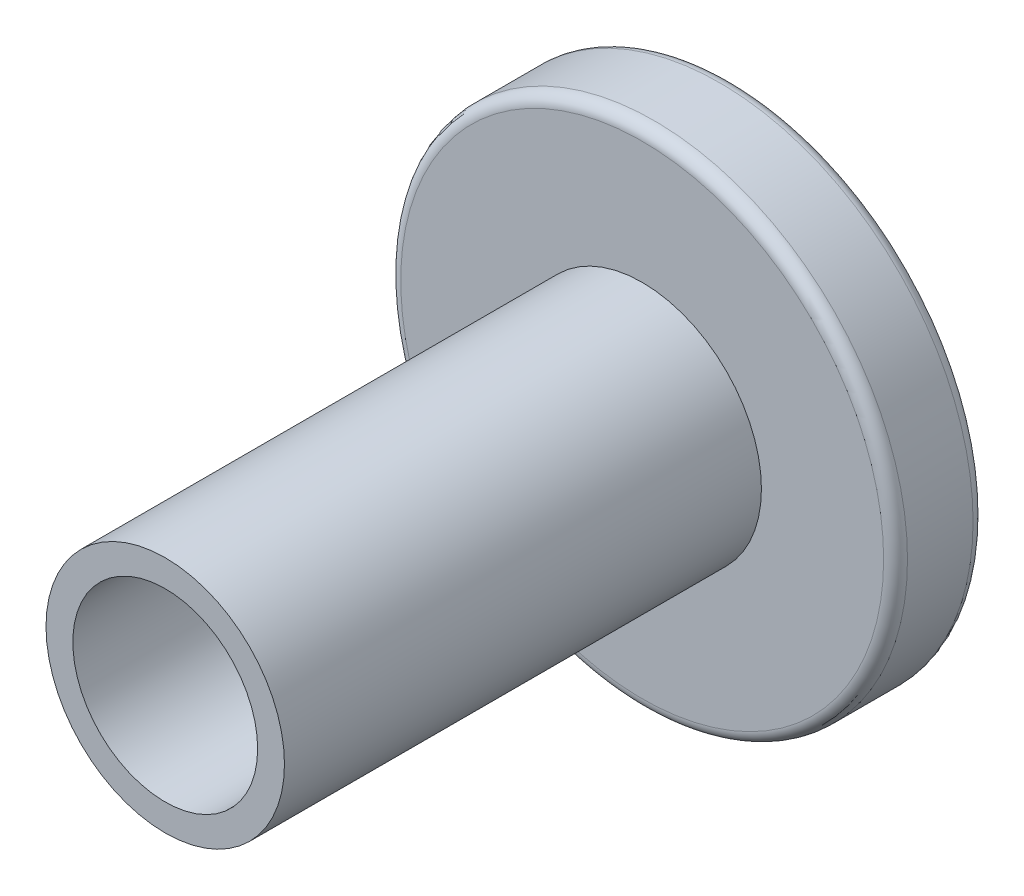
ISO-10303-21;
HEADER;
FILE_DESCRIPTION(('STEP AP214'),'2;1');
FILE_NAME('part.step','',(''),(''),'','','');
FILE_SCHEMA(('AUTOMOTIVE_DESIGN { 1 0 10303 214 1 1 1 1 }'));
ENDSEC;
DATA;
#1=APPLICATION_CONTEXT('core data for automotive mechanical design processes');
#2=APPLICATION_PROTOCOL_DEFINITION('international standard','automotive_design',2000,#1);
#3=PRODUCT_CONTEXT('',#1,'mechanical');
#4=PRODUCT('Part','Part','',(#3));
#5=PRODUCT_RELATED_PRODUCT_CATEGORY('part','',(#4));
#6=PRODUCT_DEFINITION_FORMATION('','',#4);
#7=PRODUCT_DEFINITION_CONTEXT('part definition',#1,'design');
#8=PRODUCT_DEFINITION('design','',#6,#7);
#9=PRODUCT_DEFINITION_SHAPE('','',#8);
#10=(LENGTH_UNIT() NAMED_UNIT(*) SI_UNIT(.MILLI.,.METRE.));
#11=(NAMED_UNIT(*) PLANE_ANGLE_UNIT() SI_UNIT($,.RADIAN.));
#12=(NAMED_UNIT(*) SI_UNIT($,.STERADIAN.) SOLID_ANGLE_UNIT());
#13=UNCERTAINTY_MEASURE_WITH_UNIT(LENGTH_MEASURE(1.E-05),#10,'distance_accuracy_value','');
#14=(GEOMETRIC_REPRESENTATION_CONTEXT(3) GLOBAL_UNCERTAINTY_ASSIGNED_CONTEXT((#13)) GLOBAL_UNIT_ASSIGNED_CONTEXT((#10,
#11,#12)) REPRESENTATION_CONTEXT('',''));
#15=CARTESIAN_POINT('',(0.,0.,0.));
#16=DIRECTION('',(0.,0.,1.));
#17=DIRECTION('',(1.,0.,0.));
#18=AXIS2_PLACEMENT_3D('',#15,#16,#17);
#19=CARTESIAN_POINT('',(0.,0.,1.5));
#20=DIRECTION('',(0.,0.,1.));
#21=DIRECTION('',(1.,0.,0.));
#22=AXIS2_PLACEMENT_3D('',#19,#20,#21);
#23=PLANE('',#22);
#24=CARTESIAN_POINT('',(0.,0.,1.5));
#25=DIRECTION('',(0.,0.,1.));
#26=DIRECTION('',(1.,0.,0.));
#27=AXIS2_PLACEMENT_3D('',#24,#25,#26);
#28=CIRCLE('',#27,1.55);
#29=CARTESIAN_POINT('',(1.55,0.,1.5));
#30=VERTEX_POINT('',#29);
#31=EDGE_CURVE('E153',#30,#30,#28,.F.);
#32=ORIENTED_EDGE('',*,*,#31,.F.);
#33=EDGE_LOOP('',(#32));
#34=FACE_BOUND('',#33,.T.);
#35=DIRECTION('',(-1.,0.,0.));
#36=VECTOR('',#35,1.);
#37=CARTESIAN_POINT('',(0.721687836487032,-1.25,1.5));
#38=LINE('',#37,#36);
#39=CARTESIAN_POINT('',(0.721687836487032,-1.25,1.5));
#40=VERTEX_POINT('',#39);
#41=CARTESIAN_POINT('',(-0.721687836487033,-1.25,1.5));
#42=VERTEX_POINT('',#41);
#43=EDGE_CURVE('E104',#40,#42,#38,.T.);
#44=ORIENTED_EDGE('',*,*,#43,.T.);
#45=DIRECTION('',(-0.5,0.866025403784439,0.));
#46=VECTOR('',#45,1.);
#47=CARTESIAN_POINT('',(-0.721687836487033,-1.25,1.5));
#48=LINE('',#47,#46);
#49=CARTESIAN_POINT('',(-1.44337567297407,0.,1.5));
#50=VERTEX_POINT('',#49);
#51=EDGE_CURVE('E98',#42,#50,#48,.T.);
#52=ORIENTED_EDGE('',*,*,#51,.T.);
#53=DIRECTION('',(0.5,0.866025403784438,0.));
#54=VECTOR('',#53,1.);
#55=CARTESIAN_POINT('',(-1.44337567297407,0.,1.5));
#56=LINE('',#55,#54);
#57=CARTESIAN_POINT('',(-0.721687836487032,1.25,1.5));
#58=VERTEX_POINT('',#57);
#59=EDGE_CURVE('E107',#50,#58,#56,.T.);
#60=ORIENTED_EDGE('',*,*,#59,.T.);
#61=DIRECTION('',(1.,0.,0.));
#62=VECTOR('',#61,1.);
#63=CARTESIAN_POINT('',(-0.721687836487032,1.25,1.5));
#64=LINE('',#63,#62);
#65=CARTESIAN_POINT('',(0.721687836487032,1.25,1.5));
#66=VERTEX_POINT('',#65);
#67=EDGE_CURVE('E58',#58,#66,#64,.T.);
#68=ORIENTED_EDGE('',*,*,#67,.T.);
#69=DIRECTION('',(0.5,-0.866025403784439,0.));
#70=VECTOR('',#69,1.);
#71=CARTESIAN_POINT('',(0.721687836487032,1.25,1.5));
#72=LINE('',#71,#70);
#73=CARTESIAN_POINT('',(1.44337567297406,0.,1.5));
#74=VERTEX_POINT('',#73);
#75=EDGE_CURVE('E120',#66,#74,#72,.T.);
#76=ORIENTED_EDGE('',*,*,#75,.T.);
#77=DIRECTION('',(-0.5,-0.866025403784438,0.));
#78=VECTOR('',#77,1.);
#79=CARTESIAN_POINT('',(1.44337567297406,0.,1.5));
#80=LINE('',#79,#78);
#81=EDGE_CURVE('E123',#74,#40,#80,.T.);
#82=ORIENTED_EDGE('',*,*,#81,.T.);
#83=EDGE_LOOP('',(#44,#52,#60,#68,#76,#82));
#84=FACE_BOUND('',#83,.T.);
#85=ADVANCED_FACE('F43',(#34,#84),#23,.T.);
#86=CARTESIAN_POINT('',(0.,0.,1.5));
#87=DIRECTION('',(0.,0.,-1.));
#88=DIRECTION('',(-1.,0.,0.));
#89=AXIS2_PLACEMENT_3D('',#86,#87,#88);
#90=CYLINDRICAL_SURFACE('',#89,4.25);
#91=CARTESIAN_POINT('',(0.,0.,0.2));
#92=DIRECTION('',(0.,0.,1.));
#93=DIRECTION('',(1.,0.,0.));
#94=AXIS2_PLACEMENT_3D('',#91,#92,#93);
#95=CIRCLE('',#94,4.25);
#96=CARTESIAN_POINT('',(4.25,0.,0.2));
#97=VERTEX_POINT('',#96);
#98=EDGE_CURVE('E161',#97,#97,#95,.T.);
#99=ORIENTED_EDGE('',*,*,#98,.T.);
#100=EDGE_LOOP('',(#99));
#101=FACE_BOUND('',#100,.T.);
#102=CARTESIAN_POINT('',(0.,0.,1.3));
#103=DIRECTION('',(0.,0.,1.));
#104=DIRECTION('',(1.,0.,0.));
#105=AXIS2_PLACEMENT_3D('',#102,#103,#104);
#106=CIRCLE('',#105,4.25);
#107=CARTESIAN_POINT('',(4.25,0.,1.3));
#108=VERTEX_POINT('',#107);
#109=EDGE_CURVE('E158',#108,#108,#106,.F.);
#110=ORIENTED_EDGE('',*,*,#109,.T.);
#111=EDGE_LOOP('',(#110));
#112=FACE_BOUND('',#111,.T.);
#113=ADVANCED_FACE('F174',(#101,#112),#90,.T.);
#114=CARTESIAN_POINT('',(0.,0.,1.5));
#115=DIRECTION('',(0.,0.,1.));
#116=DIRECTION('',(1.,0.,0.));
#117=AXIS2_PLACEMENT_3D('',#114,#115,#116);
#118=CIRCLE('',#117,4.05);
#119=CARTESIAN_POINT('',(4.05,0.,1.5));
#120=VERTEX_POINT('',#119);
#121=EDGE_CURVE('E11',#120,#120,#118,.T.);
#122=ORIENTED_EDGE('',*,*,#121,.T.);
#123=EDGE_LOOP('',(#122));
#124=FACE_BOUND('',#123,.T.);
#125=CARTESIAN_POINT('',(0.,0.,1.5));
#126=DIRECTION('',(0.,0.,1.));
#127=DIRECTION('',(1.,0.,0.));
#128=AXIS2_PLACEMENT_3D('',#125,#126,#127);
#129=CIRCLE('',#128,2.);
#130=CARTESIAN_POINT('',(2.,0.,1.5));
#131=VERTEX_POINT('',#130);
#132=EDGE_CURVE('E149',#131,#131,#129,.T.);
#133=ORIENTED_EDGE('',*,*,#132,.F.);
#134=EDGE_LOOP('',(#133));
#135=FACE_BOUND('',#134,.T.);
#136=ADVANCED_FACE('F177',(#124,#135),#23,.T.);
#137=CARTESIAN_POINT('',(0.,0.,0.));
#138=DIRECTION('',(0.,0.,1.));
#139=DIRECTION('',(1.,0.,0.));
#140=AXIS2_PLACEMENT_3D('',#137,#138,#139);
#141=PLANE('',#140);
#142=DIRECTION('',(0.5,0.866025403784438,0.));
#143=VECTOR('',#142,1.);
#144=CARTESIAN_POINT('',(-1.44337567297407,0.,0.));
#145=LINE('',#144,#143);
#146=CARTESIAN_POINT('',(-1.44337567297407,0.,0.));
#147=VERTEX_POINT('',#146);
#148=CARTESIAN_POINT('',(-0.721687836487032,1.25,0.));
#149=VERTEX_POINT('',#148);
#150=EDGE_CURVE('E127',#147,#149,#145,.T.);
#151=ORIENTED_EDGE('',*,*,#150,.F.);
#152=DIRECTION('',(-0.5,0.866025403784439,0.));
#153=VECTOR('',#152,1.);
#154=CARTESIAN_POINT('',(-0.721687836487033,-1.25,0.));
#155=LINE('',#154,#153);
#156=CARTESIAN_POINT('',(-0.721687836487033,-1.25,0.));
#157=VERTEX_POINT('',#156);
#158=EDGE_CURVE('E66',#157,#147,#155,.T.);
#159=ORIENTED_EDGE('',*,*,#158,.F.);
#160=DIRECTION('',(-1.,0.,0.));
#161=VECTOR('',#160,1.);
#162=CARTESIAN_POINT('',(0.721687836487032,-1.25,0.));
#163=LINE('',#162,#161);
#164=CARTESIAN_POINT('',(0.721687836487032,-1.25,0.));
#165=VERTEX_POINT('',#164);
#166=EDGE_CURVE('E113',#165,#157,#163,.T.);
#167=ORIENTED_EDGE('',*,*,#166,.F.);
#168=DIRECTION('',(-0.5,-0.866025403784438,0.));
#169=VECTOR('',#168,1.);
#170=CARTESIAN_POINT('',(1.44337567297406,0.,0.));
#171=LINE('',#170,#169);
#172=CARTESIAN_POINT('',(1.44337567297406,0.,0.));
#173=VERTEX_POINT('',#172);
#174=EDGE_CURVE('E116',#173,#165,#171,.T.);
#175=ORIENTED_EDGE('',*,*,#174,.F.);
#176=DIRECTION('',(0.5,-0.866025403784439,0.));
#177=VECTOR('',#176,1.);
#178=CARTESIAN_POINT('',(0.721687836487032,1.25,0.));
#179=LINE('',#178,#177);
#180=CARTESIAN_POINT('',(0.721687836487032,1.25,0.));
#181=VERTEX_POINT('',#180);
#182=EDGE_CURVE('E132',#181,#173,#179,.T.);
#183=ORIENTED_EDGE('',*,*,#182,.F.);
#184=DIRECTION('',(1.,0.,0.));
#185=VECTOR('',#184,1.);
#186=CARTESIAN_POINT('',(-0.721687836487032,1.25,0.));
#187=LINE('',#186,#185);
#188=EDGE_CURVE('E129',#149,#181,#187,.T.);
#189=ORIENTED_EDGE('',*,*,#188,.F.);
#190=EDGE_LOOP('',(#151,#159,#167,#175,#183,#189));
#191=FACE_BOUND('',#190,.T.);
#192=CARTESIAN_POINT('',(0.,0.,0.));
#193=DIRECTION('',(0.,0.,1.));
#194=DIRECTION('',(1.,0.,0.));
#195=AXIS2_PLACEMENT_3D('',#192,#193,#194);
#196=CIRCLE('',#195,4.05);
#197=CARTESIAN_POINT('',(4.05,0.,0.));
#198=VERTEX_POINT('',#197);
#199=EDGE_CURVE('E51',#198,#198,#196,.F.);
#200=ORIENTED_EDGE('',*,*,#199,.T.);
#201=EDGE_LOOP('',(#200));
#202=FACE_BOUND('',#201,.T.);
#203=ADVANCED_FACE('F166',(#191,#202),#141,.F.);
#204=CARTESIAN_POINT('',(0.,0.,9.5));
#205=DIRECTION('',(0.,0.,1.));
#206=DIRECTION('',(1.,0.,0.));
#207=AXIS2_PLACEMENT_3D('',#204,#205,#206);
#208=PLANE('',#207);
#209=CARTESIAN_POINT('',(0.,0.,9.5));
#210=DIRECTION('',(0.,0.,1.));
#211=DIRECTION('',(1.,0.,0.));
#212=AXIS2_PLACEMENT_3D('',#209,#210,#211);
#213=CIRCLE('',#212,2.);
#214=CARTESIAN_POINT('',(2.,0.,9.5));
#215=VERTEX_POINT('',#214);
#216=EDGE_CURVE('E150',#215,#215,#213,.T.);
#217=ORIENTED_EDGE('',*,*,#216,.T.);
#218=EDGE_LOOP('',(#217));
#219=FACE_BOUND('',#218,.T.);
#220=CARTESIAN_POINT('',(0.,0.,9.5));
#221=DIRECTION('',(0.,0.,1.));
#222=DIRECTION('',(1.,0.,0.));
#223=AXIS2_PLACEMENT_3D('',#220,#221,#222);
#224=CIRCLE('',#223,1.55);
#225=CARTESIAN_POINT('',(1.55,0.,9.5));
#226=VERTEX_POINT('',#225);
#227=EDGE_CURVE('E139',#226,#226,#224,.T.);
#228=ORIENTED_EDGE('',*,*,#227,.F.);
#229=EDGE_LOOP('',(#228));
#230=FACE_BOUND('',#229,.T.);
#231=ADVANCED_FACE('F192',(#219,#230),#208,.T.);
#232=CARTESIAN_POINT('',(0.,0.,9.5));
#233=DIRECTION('',(0.,0.,-1.));
#234=DIRECTION('',(-1.,0.,0.));
#235=AXIS2_PLACEMENT_3D('',#232,#233,#234);
#236=CYLINDRICAL_SURFACE('',#235,2.);
#237=ORIENTED_EDGE('',*,*,#216,.F.);
#238=EDGE_LOOP('',(#237));
#239=FACE_BOUND('',#238,.T.);
#240=ORIENTED_EDGE('',*,*,#132,.T.);
#241=EDGE_LOOP('',(#240));
#242=FACE_BOUND('',#241,.T.);
#243=ADVANCED_FACE('F190',(#239,#242),#236,.T.);
#244=CARTESIAN_POINT('',(0.,0.,9.5));
#245=DIRECTION('',(0.,0.,-1.));
#246=DIRECTION('',(-1.,0.,0.));
#247=AXIS2_PLACEMENT_3D('',#244,#245,#246);
#248=CYLINDRICAL_SURFACE('',#247,1.55);
#249=ORIENTED_EDGE('',*,*,#227,.T.);
#250=EDGE_LOOP('',(#249));
#251=FACE_BOUND('',#250,.T.);
#252=ORIENTED_EDGE('',*,*,#31,.T.);
#253=EDGE_LOOP('',(#252));
#254=FACE_BOUND('',#253,.T.);
#255=ADVANCED_FACE('F171',(#251,#254),#248,.F.);
#256=CARTESIAN_POINT('',(0.,0.,0.2));
#257=DIRECTION('',(0.,0.,1.));
#258=DIRECTION('',(1.,0.,0.));
#259=AXIS2_PLACEMENT_3D('',#256,#257,#258);
#260=TOROIDAL_SURFACE('',#259,4.05,0.2);
#261=ORIENTED_EDGE('',*,*,#199,.F.);
#262=EDGE_LOOP('',(#261));
#263=FACE_BOUND('',#262,.T.);
#264=ORIENTED_EDGE('',*,*,#98,.F.);
#265=EDGE_LOOP('',(#264));
#266=FACE_BOUND('',#265,.T.);
#267=ADVANCED_FACE('F168',(#263,#266),#260,.T.);
#268=CARTESIAN_POINT('',(0.,0.,1.3));
#269=DIRECTION('',(0.,0.,1.));
#270=DIRECTION('',(1.,0.,0.));
#271=AXIS2_PLACEMENT_3D('',#268,#269,#270);
#272=TOROIDAL_SURFACE('',#271,4.05,0.2);
#273=ORIENTED_EDGE('',*,*,#109,.F.);
#274=EDGE_LOOP('',(#273));
#275=FACE_BOUND('',#274,.T.);
#276=ORIENTED_EDGE('',*,*,#121,.F.);
#277=EDGE_LOOP('',(#276));
#278=FACE_BOUND('',#277,.T.);
#279=ADVANCED_FACE('F45',(#275,#278),#272,.T.);
#280=CARTESIAN_POINT('',(-0.721687836487033,-1.25,1.5));
#281=DIRECTION('',(-0.866025403784439,-0.5,0.));
#282=DIRECTION('',(0.5,-0.866025403784439,0.));
#283=AXIS2_PLACEMENT_3D('',#280,#281,#282);
#284=PLANE('',#283);
#285=ORIENTED_EDGE('',*,*,#158,.T.);
#286=DIRECTION('',(0.,0.,-1.));
#287=VECTOR('',#286,1.);
#288=CARTESIAN_POINT('',(-1.44337567297407,0.,1.5));
#289=LINE('',#288,#287);
#290=EDGE_CURVE('E94',#50,#147,#289,.T.);
#291=ORIENTED_EDGE('',*,*,#290,.F.);
#292=ORIENTED_EDGE('',*,*,#51,.F.);
#293=DIRECTION('',(0.,0.,-1.));
#294=VECTOR('',#293,1.);
#295=CARTESIAN_POINT('',(-0.721687836487033,-1.25,1.5));
#296=LINE('',#295,#294);
#297=EDGE_CURVE('E137',#42,#157,#296,.T.);
#298=ORIENTED_EDGE('',*,*,#297,.T.);
#299=EDGE_LOOP('',(#285,#291,#292,#298));
#300=FACE_BOUND('',#299,.T.);
#301=ADVANCED_FACE('F96',(#300),#284,.F.);
#302=CARTESIAN_POINT('',(0.721687836487032,-1.25,1.5));
#303=DIRECTION('',(0.,-1.,0.));
#304=DIRECTION('',(0.,0.,-1.));
#305=AXIS2_PLACEMENT_3D('',#302,#303,#304);
#306=PLANE('',#305);
#307=ORIENTED_EDGE('',*,*,#166,.T.);
#308=ORIENTED_EDGE('',*,*,#297,.F.);
#309=ORIENTED_EDGE('',*,*,#43,.F.);
#310=DIRECTION('',(0.,0.,-1.));
#311=VECTOR('',#310,1.);
#312=CARTESIAN_POINT('',(0.721687836487032,-1.25,1.5));
#313=LINE('',#312,#311);
#314=EDGE_CURVE('E140',#40,#165,#313,.T.);
#315=ORIENTED_EDGE('',*,*,#314,.T.);
#316=EDGE_LOOP('',(#307,#308,#309,#315));
#317=FACE_BOUND('',#316,.T.);
#318=ADVANCED_FACE('F227',(#317),#306,.F.);
#319=CARTESIAN_POINT('',(1.44337567297406,0.,1.5));
#320=DIRECTION('',(0.866025403784438,-0.5,0.));
#321=DIRECTION('',(0.5,0.866025403784439,0.));
#322=AXIS2_PLACEMENT_3D('',#319,#320,#321);
#323=PLANE('',#322);
#324=ORIENTED_EDGE('',*,*,#174,.T.);
#325=ORIENTED_EDGE('',*,*,#314,.F.);
#326=ORIENTED_EDGE('',*,*,#81,.F.);
#327=DIRECTION('',(0.,0.,-1.));
#328=VECTOR('',#327,1.);
#329=CARTESIAN_POINT('',(1.44337567297406,0.,1.5));
#330=LINE('',#329,#328);
#331=EDGE_CURVE('E142',#74,#173,#330,.T.);
#332=ORIENTED_EDGE('',*,*,#331,.T.);
#333=EDGE_LOOP('',(#324,#325,#326,#332));
#334=FACE_BOUND('',#333,.T.);
#335=ADVANCED_FACE('F225',(#334),#323,.F.);
#336=CARTESIAN_POINT('',(0.721687836487032,1.25,1.5));
#337=DIRECTION('',(0.866025403784438,0.5,0.));
#338=DIRECTION('',(-0.5,0.866025403784439,0.));
#339=AXIS2_PLACEMENT_3D('',#336,#337,#338);
#340=PLANE('',#339);
#341=ORIENTED_EDGE('',*,*,#182,.T.);
#342=ORIENTED_EDGE('',*,*,#331,.F.);
#343=ORIENTED_EDGE('',*,*,#75,.F.);
#344=DIRECTION('',(0.,0.,-1.));
#345=VECTOR('',#344,1.);
#346=CARTESIAN_POINT('',(0.721687836487032,1.25,1.5));
#347=LINE('',#346,#345);
#348=EDGE_CURVE('E144',#66,#181,#347,.T.);
#349=ORIENTED_EDGE('',*,*,#348,.T.);
#350=EDGE_LOOP('',(#341,#342,#343,#349));
#351=FACE_BOUND('',#350,.T.);
#352=ADVANCED_FACE('F222',(#351),#340,.F.);
#353=CARTESIAN_POINT('',(-0.721687836487032,1.25,1.5));
#354=DIRECTION('',(0.,1.,0.));
#355=DIRECTION('',(0.,0.,1.));
#356=AXIS2_PLACEMENT_3D('',#353,#354,#355);
#357=PLANE('',#356);
#358=ORIENTED_EDGE('',*,*,#188,.T.);
#359=ORIENTED_EDGE('',*,*,#348,.F.);
#360=ORIENTED_EDGE('',*,*,#67,.F.);
#361=DIRECTION('',(0.,0.,-1.));
#362=VECTOR('',#361,1.);
#363=CARTESIAN_POINT('',(-0.721687836487032,1.25,1.5));
#364=LINE('',#363,#362);
#365=EDGE_CURVE('E103',#58,#149,#364,.T.);
#366=ORIENTED_EDGE('',*,*,#365,.T.);
#367=EDGE_LOOP('',(#358,#359,#360,#366));
#368=FACE_BOUND('',#367,.T.);
#369=ADVANCED_FACE('F219',(#368),#357,.F.);
#370=CARTESIAN_POINT('',(-1.44337567297407,0.,1.5));
#371=DIRECTION('',(-0.866025403784438,0.5,0.));
#372=DIRECTION('',(-0.5,-0.866025403784438,0.));
#373=AXIS2_PLACEMENT_3D('',#370,#371,#372);
#374=PLANE('',#373);
#375=ORIENTED_EDGE('',*,*,#150,.T.);
#376=ORIENTED_EDGE('',*,*,#365,.F.);
#377=ORIENTED_EDGE('',*,*,#59,.F.);
#378=ORIENTED_EDGE('',*,*,#290,.T.);
#379=EDGE_LOOP('',(#375,#376,#377,#378));
#380=FACE_BOUND('',#379,.T.);
#381=ADVANCED_FACE('F108',(#380),#374,.F.);
#382=CLOSED_SHELL('',(#85,#113,#136,#203,#231,#243,#255,#267,#279,#301,#318,#335,#352,#369,#381));
#383=MANIFOLD_SOLID_BREP('B2',#382);
#384=ADVANCED_BREP_SHAPE_REPRESENTATION('',(#18,#383),#14);
#385=SHAPE_DEFINITION_REPRESENTATION(#9,#384);
ENDSEC;
END-ISO-10303-21;
